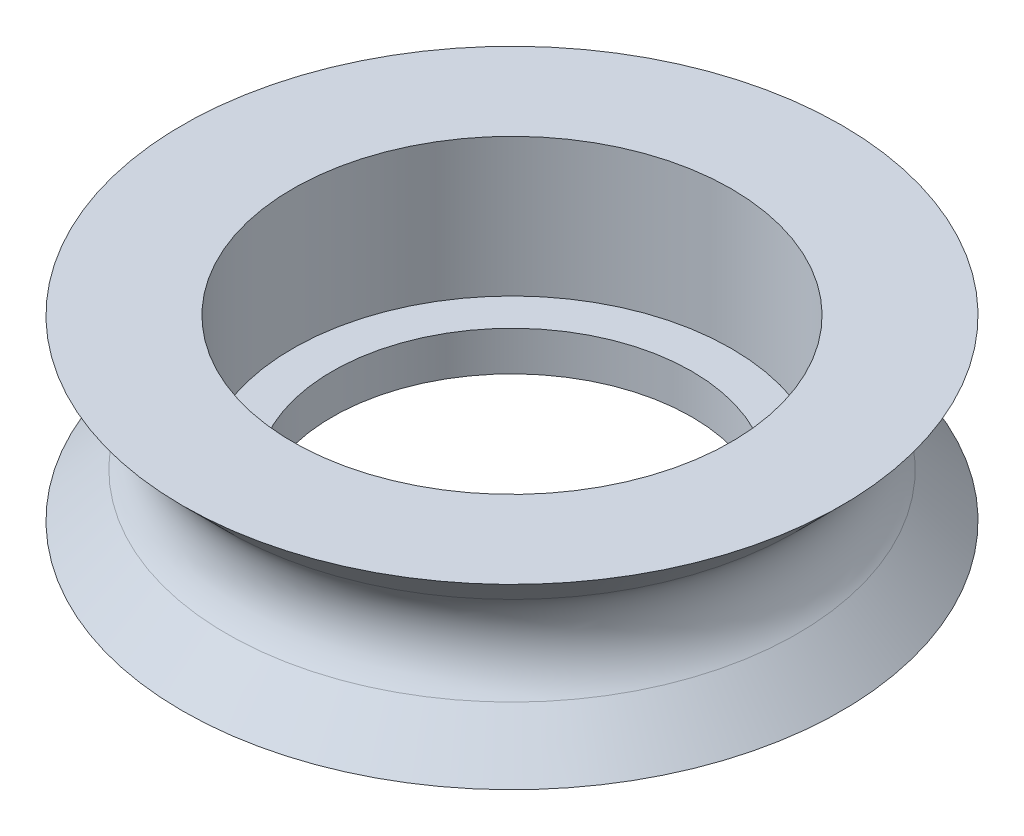
ISO-10303-21;
HEADER;
FILE_DESCRIPTION(('STEP AP214'),'2;1');
FILE_NAME('part.step','',(''),(''),'','','');
FILE_SCHEMA(('AUTOMOTIVE_DESIGN { 1 0 10303 214 1 1 1 1 }'));
ENDSEC;
DATA;
#1=APPLICATION_CONTEXT('core data for automotive mechanical design processes');
#2=APPLICATION_PROTOCOL_DEFINITION('international standard','automotive_design',2000,#1);
#3=PRODUCT_CONTEXT('',#1,'mechanical');
#4=PRODUCT('Part','Part','',(#3));
#5=PRODUCT_RELATED_PRODUCT_CATEGORY('part','',(#4));
#6=PRODUCT_DEFINITION_FORMATION('','',#4);
#7=PRODUCT_DEFINITION_CONTEXT('part definition',#1,'design');
#8=PRODUCT_DEFINITION('design','',#6,#7);
#9=PRODUCT_DEFINITION_SHAPE('','',#8);
#10=(LENGTH_UNIT() NAMED_UNIT(*) SI_UNIT(.MILLI.,.METRE.));
#11=(NAMED_UNIT(*) PLANE_ANGLE_UNIT() SI_UNIT($,.RADIAN.));
#12=(NAMED_UNIT(*) SI_UNIT($,.STERADIAN.) SOLID_ANGLE_UNIT());
#13=UNCERTAINTY_MEASURE_WITH_UNIT(LENGTH_MEASURE(1.E-05),#10,'distance_accuracy_value','');
#14=(GEOMETRIC_REPRESENTATION_CONTEXT(3) GLOBAL_UNCERTAINTY_ASSIGNED_CONTEXT((#13)) GLOBAL_UNIT_ASSIGNED_CONTEXT((#10,
#11,#12)) REPRESENTATION_CONTEXT('',''));
#15=CARTESIAN_POINT('',(0.,0.,0.));
#16=DIRECTION('',(0.,0.,1.));
#17=DIRECTION('',(1.,0.,0.));
#18=AXIS2_PLACEMENT_3D('',#15,#16,#17);
#19=CARTESIAN_POINT('',(11.1,0.,0.));
#20=DIRECTION('',(0.,1.,0.));
#21=DIRECTION('',(0.,0.,1.));
#22=AXIS2_PLACEMENT_3D('',#19,#20,#21);
#23=PLANE('',#22);
#24=CARTESIAN_POINT('',(0.,0.,0.));
#25=DIRECTION('',(0.,-1.,0.));
#26=DIRECTION('',(0.,0.,-1.));
#27=AXIS2_PLACEMENT_3D('',#24,#25,#26);
#28=CIRCLE('',#27,9.1);
#29=CARTESIAN_POINT('',(0.,0.,-9.1));
#30=VERTEX_POINT('',#29);
#31=EDGE_CURVE('E10',#30,#30,#28,.T.);
#32=ORIENTED_EDGE('',*,*,#31,.T.);
#33=EDGE_LOOP('',(#32));
#34=FACE_BOUND('',#33,.T.);
#35=CARTESIAN_POINT('',(0.,0.,0.));
#36=DIRECTION('',(0.,-1.,0.));
#37=DIRECTION('',(0.,0.,-1.));
#38=AXIS2_PLACEMENT_3D('',#35,#36,#37);
#39=CIRCLE('',#38,11.1);
#40=CARTESIAN_POINT('',(0.,0.,-11.1));
#41=VERTEX_POINT('',#40);
#42=EDGE_CURVE('E58',#41,#41,#39,.T.);
#43=ORIENTED_EDGE('',*,*,#42,.F.);
#44=EDGE_LOOP('',(#43));
#45=FACE_BOUND('',#44,.T.);
#46=ADVANCED_FACE('F30',(#34,#45),#23,.T.);
#47=CARTESIAN_POINT('',(0.,0.,0.));
#48=DIRECTION('',(0.,-1.,0.));
#49=DIRECTION('',(0.,0.,-1.));
#50=AXIS2_PLACEMENT_3D('',#47,#48,#49);
#51=CYLINDRICAL_SURFACE('',#50,9.1);
#52=CARTESIAN_POINT('',(0.,-2.,0.));
#53=DIRECTION('',(0.,-1.,0.));
#54=DIRECTION('',(0.,0.,-1.));
#55=AXIS2_PLACEMENT_3D('',#52,#53,#54);
#56=CIRCLE('',#55,9.1);
#57=CARTESIAN_POINT('',(0.,-2.,-9.1));
#58=VERTEX_POINT('',#57);
#59=EDGE_CURVE('E36',#58,#58,#56,.T.);
#60=ORIENTED_EDGE('',*,*,#59,.T.);
#61=EDGE_LOOP('',(#60));
#62=FACE_BOUND('',#61,.T.);
#63=ORIENTED_EDGE('',*,*,#31,.F.);
#64=EDGE_LOOP('',(#63));
#65=FACE_BOUND('',#64,.T.);
#66=ADVANCED_FACE('F66',(#62,#65),#51,.F.);
#67=CARTESIAN_POINT('',(9.1,-2.,0.));
#68=DIRECTION('',(0.,-1.,0.));
#69=DIRECTION('',(0.,0.,-1.));
#70=AXIS2_PLACEMENT_3D('',#67,#68,#69);
#71=PLANE('',#70);
#72=CARTESIAN_POINT('',(0.,-2.,0.));
#73=DIRECTION('',(0.,-1.,0.));
#74=DIRECTION('',(0.,0.,-1.));
#75=AXIS2_PLACEMENT_3D('',#72,#73,#74);
#76=CIRCLE('',#75,16.6819805153395);
#77=CARTESIAN_POINT('',(0.,-2.,-16.6819805153395));
#78=VERTEX_POINT('',#77);
#79=EDGE_CURVE('E40',#78,#78,#76,.T.);
#80=ORIENTED_EDGE('',*,*,#79,.T.);
#81=EDGE_LOOP('',(#80));
#82=FACE_BOUND('',#81,.T.);
#83=ORIENTED_EDGE('',*,*,#59,.F.);
#84=EDGE_LOOP('',(#83));
#85=FACE_BOUND('',#84,.T.);
#86=ADVANCED_FACE('F70',(#82,#85),#71,.T.);
#87=CARTESIAN_POINT('',(0.,-2.,0.));
#88=DIRECTION('',(0.,-1.,0.));
#89=DIRECTION('',(0.,0.,-1.));
#90=AXIS2_PLACEMENT_3D('',#87,#88,#89);
#91=CONICAL_SURFACE('',#90,16.6819805153395,0.785398163397453);
#92=CARTESIAN_POINT('',(0.,0.249999999999976,0.));
#93=DIRECTION('',(0.,-1.,0.));
#94=DIRECTION('',(0.,0.,-1.));
#95=AXIS2_PLACEMENT_3D('',#92,#93,#94);
#96=CIRCLE('',#95,14.4319805153395);
#97=CARTESIAN_POINT('',(0.,0.249999999999976,-14.4319805153395));
#98=VERTEX_POINT('',#97);
#99=EDGE_CURVE('E44',#98,#98,#96,.T.);
#100=ORIENTED_EDGE('',*,*,#99,.T.);
#101=EDGE_LOOP('',(#100));
#102=FACE_BOUND('',#101,.T.);
#103=ORIENTED_EDGE('',*,*,#79,.F.);
#104=EDGE_LOOP('',(#103));
#105=FACE_BOUND('',#104,.T.);
#106=ADVANCED_FACE('F74',(#102,#105),#91,.T.);
#107=CARTESIAN_POINT('',(0.,2.5,0.));
#108=DIRECTION('',(0.,-1.,0.));
#109=DIRECTION('',(0.,0.,-1.));
#110=AXIS2_PLACEMENT_3D('',#107,#108,#109);
#111=TOROIDAL_SURFACE('',#110,16.6819805153395,3.18198051533948);
#112=CARTESIAN_POINT('',(0.,4.75000000000002,0.));
#113=DIRECTION('',(0.,-1.,0.));
#114=DIRECTION('',(0.,0.,-1.));
#115=AXIS2_PLACEMENT_3D('',#112,#113,#114);
#116=CIRCLE('',#115,14.4319805153395);
#117=CARTESIAN_POINT('',(0.,4.75000000000002,-14.4319805153395));
#118=VERTEX_POINT('',#117);
#119=EDGE_CURVE('E49',#118,#118,#116,.T.);
#120=ORIENTED_EDGE('',*,*,#119,.T.);
#121=EDGE_LOOP('',(#120));
#122=FACE_BOUND('',#121,.T.);
#123=ORIENTED_EDGE('',*,*,#99,.F.);
#124=EDGE_LOOP('',(#123));
#125=FACE_BOUND('',#124,.T.);
#126=ADVANCED_FACE('F81',(#122,#125),#111,.F.);
#127=CARTESIAN_POINT('',(0.,4.75000000000002,0.));
#128=DIRECTION('',(0.,1.,0.));
#129=DIRECTION('',(0.,0.,1.));
#130=AXIS2_PLACEMENT_3D('',#127,#128,#129);
#131=CONICAL_SURFACE('',#130,14.4319805153395,0.785398163397453);
#132=CARTESIAN_POINT('',(0.,7.,0.));
#133=DIRECTION('',(0.,-1.,0.));
#134=DIRECTION('',(0.,0.,-1.));
#135=AXIS2_PLACEMENT_3D('',#132,#133,#134);
#136=CIRCLE('',#135,16.6819805153395);
#137=CARTESIAN_POINT('',(0.,7.,-16.6819805153395));
#138=VERTEX_POINT('',#137);
#139=EDGE_CURVE('E52',#138,#138,#136,.T.);
#140=ORIENTED_EDGE('',*,*,#139,.T.);
#141=EDGE_LOOP('',(#140));
#142=FACE_BOUND('',#141,.T.);
#143=ORIENTED_EDGE('',*,*,#119,.F.);
#144=EDGE_LOOP('',(#143));
#145=FACE_BOUND('',#144,.T.);
#146=ADVANCED_FACE('F85',(#142,#145),#131,.T.);
#147=CARTESIAN_POINT('',(11.1,7.,0.));
#148=DIRECTION('',(0.,1.,0.));
#149=DIRECTION('',(0.,0.,1.));
#150=AXIS2_PLACEMENT_3D('',#147,#148,#149);
#151=PLANE('',#150);
#152=CARTESIAN_POINT('',(0.,7.,0.));
#153=DIRECTION('',(0.,-1.,0.));
#154=DIRECTION('',(0.,0.,-1.));
#155=AXIS2_PLACEMENT_3D('',#152,#153,#154);
#156=CIRCLE('',#155,11.1);
#157=CARTESIAN_POINT('',(0.,7.,-11.1));
#158=VERTEX_POINT('',#157);
#159=EDGE_CURVE('E55',#158,#158,#156,.T.);
#160=ORIENTED_EDGE('',*,*,#159,.T.);
#161=EDGE_LOOP('',(#160));
#162=FACE_BOUND('',#161,.T.);
#163=ORIENTED_EDGE('',*,*,#139,.F.);
#164=EDGE_LOOP('',(#163));
#165=FACE_BOUND('',#164,.T.);
#166=ADVANCED_FACE('F89',(#162,#165),#151,.T.);
#167=CARTESIAN_POINT('',(0.,0.,0.));
#168=DIRECTION('',(0.,-1.,0.));
#169=DIRECTION('',(0.,0.,-1.));
#170=AXIS2_PLACEMENT_3D('',#167,#168,#169);
#171=CYLINDRICAL_SURFACE('',#170,11.1);
#172=ORIENTED_EDGE('',*,*,#42,.T.);
#173=EDGE_LOOP('',(#172));
#174=FACE_BOUND('',#173,.T.);
#175=ORIENTED_EDGE('',*,*,#159,.F.);
#176=EDGE_LOOP('',(#175));
#177=FACE_BOUND('',#176,.T.);
#178=ADVANCED_FACE('F62',(#174,#177),#171,.F.);
#179=CLOSED_SHELL('',(#46,#66,#86,#106,#126,#146,#166,#178));
#180=MANIFOLD_SOLID_BREP('B2',#179);
#181=ADVANCED_BREP_SHAPE_REPRESENTATION('',(#18,#180),#14);
#182=SHAPE_DEFINITION_REPRESENTATION(#9,#181);
ENDSEC;
END-ISO-10303-21;
